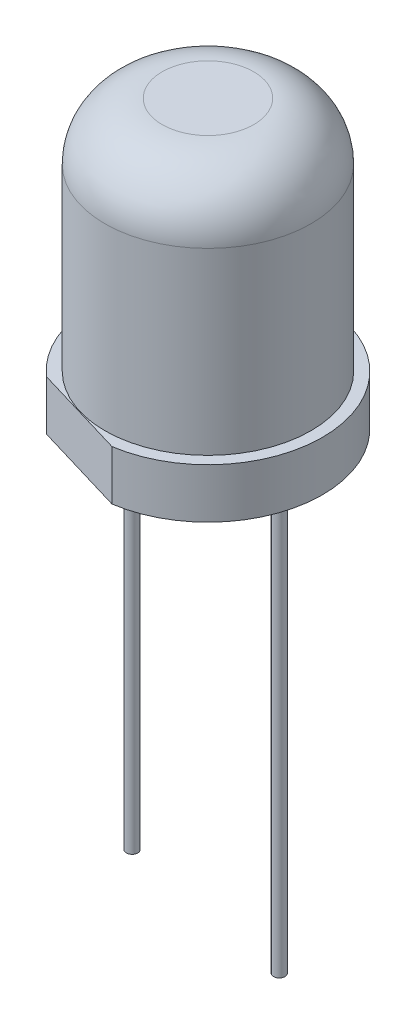
ISO-10303-21;
HEADER;
FILE_DESCRIPTION(('STEP AP214'),'2;1');
FILE_NAME('part.step','',(''),(''),'','','');
FILE_SCHEMA(('AUTOMOTIVE_DESIGN { 1 0 10303 214 1 1 1 1 }'));
ENDSEC;
DATA;
#1=APPLICATION_CONTEXT('core data for automotive mechanical design processes');
#2=APPLICATION_PROTOCOL_DEFINITION('international standard','automotive_design',2000,#1);
#3=PRODUCT_CONTEXT('',#1,'mechanical');
#4=PRODUCT('Part','Part','',(#3));
#5=PRODUCT_RELATED_PRODUCT_CATEGORY('part','',(#4));
#6=PRODUCT_DEFINITION_FORMATION('','',#4);
#7=PRODUCT_DEFINITION_CONTEXT('part definition',#1,'design');
#8=PRODUCT_DEFINITION('design','',#6,#7);
#9=PRODUCT_DEFINITION_SHAPE('','',#8);
#10=(LENGTH_UNIT() NAMED_UNIT(*) SI_UNIT(.MILLI.,.METRE.));
#11=(NAMED_UNIT(*) PLANE_ANGLE_UNIT() SI_UNIT($,.RADIAN.));
#12=(NAMED_UNIT(*) SI_UNIT($,.STERADIAN.) SOLID_ANGLE_UNIT());
#13=UNCERTAINTY_MEASURE_WITH_UNIT(LENGTH_MEASURE(1.E-05),#10,'distance_accuracy_value','');
#14=(GEOMETRIC_REPRESENTATION_CONTEXT(3) GLOBAL_UNCERTAINTY_ASSIGNED_CONTEXT((#13)) GLOBAL_UNIT_ASSIGNED_CONTEXT((#10,
#11,#12)) REPRESENTATION_CONTEXT('',''));
#15=CARTESIAN_POINT('',(0.,0.,0.));
#16=DIRECTION('',(0.,0.,1.));
#17=DIRECTION('',(1.,0.,0.));
#18=AXIS2_PLACEMENT_3D('',#15,#16,#17);
#19=CARTESIAN_POINT('',(4.,25.,0.));
#20=DIRECTION('',(0.,-1.,0.));
#21=DIRECTION('',(1.,0.,0.));
#22=AXIS2_PLACEMENT_3D('',#19,#20,#21);
#23=PLANE('',#22);
#24=CARTESIAN_POINT('',(0.,25.,0.));
#25=DIRECTION('',(0.,1.,0.));
#26=DIRECTION('',(-1.,0.,0.));
#27=AXIS2_PLACEMENT_3D('',#24,#25,#26);
#28=CIRCLE('',#27,4.);
#29=CARTESIAN_POINT('',(-4.,25.,0.));
#30=VERTEX_POINT('',#29);
#31=EDGE_CURVE('E11',#30,#30,#28,.T.);
#32=ORIENTED_EDGE('',*,*,#31,.T.);
#33=EDGE_LOOP('',(#32));
#34=FACE_BOUND('',#33,.T.);
#35=ADVANCED_FACE('F38',(#34),#23,.F.);
#36=CARTESIAN_POINT('',(0.,20.,0.));
#37=DIRECTION('',(0.,1.,0.));
#38=DIRECTION('',(-1.,0.,0.));
#39=AXIS2_PLACEMENT_3D('',#36,#37,#38);
#40=DEGENERATE_TOROIDAL_SURFACE('',#39,4.,5.,.T.);
#41=ORIENTED_EDGE('',*,*,#31,.F.);
#42=EDGE_LOOP('',(#41));
#43=FACE_BOUND('',#42,.T.);
#44=CARTESIAN_POINT('',(0.,20.,0.));
#45=DIRECTION('',(0.,1.,0.));
#46=DIRECTION('',(-1.,0.,0.));
#47=AXIS2_PLACEMENT_3D('',#44,#45,#46);
#48=CIRCLE('',#47,9.);
#49=CARTESIAN_POINT('',(-9.,20.,0.));
#50=VERTEX_POINT('',#49);
#51=EDGE_CURVE('E46',#50,#50,#48,.T.);
#52=ORIENTED_EDGE('',*,*,#51,.T.);
#53=EDGE_LOOP('',(#52));
#54=FACE_BOUND('',#53,.T.);
#55=ADVANCED_FACE('F89',(#43,#54),#40,.T.);
#56=CARTESIAN_POINT('',(0.,25.,0.));
#57=DIRECTION('',(0.,1.,0.));
#58=DIRECTION('',(-1.,0.,0.));
#59=AXIS2_PLACEMENT_3D('',#56,#57,#58);
#60=CYLINDRICAL_SURFACE('',#59,9.);
#61=ORIENTED_EDGE('',*,*,#51,.F.);
#62=EDGE_LOOP('',(#61));
#63=FACE_BOUND('',#62,.T.);
#64=CARTESIAN_POINT('',(0.,4.34657442294423,0.));
#65=DIRECTION('',(0.,1.,0.));
#66=DIRECTION('',(-1.,0.,0.));
#67=AXIS2_PLACEMENT_3D('',#64,#65,#66);
#68=CIRCLE('',#67,9.);
#69=CARTESIAN_POINT('',(-9.,4.34657442294423,0.));
#70=VERTEX_POINT('',#69);
#71=EDGE_CURVE('E79',#70,#70,#68,.T.);
#72=ORIENTED_EDGE('',*,*,#71,.T.);
#73=EDGE_LOOP('',(#72));
#74=FACE_BOUND('',#73,.T.);
#75=ADVANCED_FACE('F91',(#63,#74),#60,.T.);
#76=CARTESIAN_POINT('',(10.,4.34657442294423,0.));
#77=DIRECTION('',(0.,-1.,0.));
#78=DIRECTION('',(1.,0.,0.));
#79=AXIS2_PLACEMENT_3D('',#76,#77,#78);
#80=PLANE('',#79);
#81=ORIENTED_EDGE('',*,*,#71,.F.);
#82=EDGE_LOOP('',(#81));
#83=FACE_BOUND('',#82,.T.);
#84=CARTESIAN_POINT('',(0.,4.34657442294423,0.));
#85=DIRECTION('',(0.,1.,0.));
#86=DIRECTION('',(-1.,0.,0.));
#87=AXIS2_PLACEMENT_3D('',#84,#85,#86);
#88=CIRCLE('',#87,10.);
#89=CARTESIAN_POINT('',(1.50403820163511,4.34657442294423,9.88624646101958));
#90=VERTEX_POINT('',#89);
#91=CARTESIAN_POINT('',(-6.6676674974652,4.34657442294423,7.45266463375659));
#92=VERTEX_POINT('',#91);
#93=EDGE_CURVE('E74',#90,#92,#88,.T.);
#94=ORIENTED_EDGE('',*,*,#93,.T.);
#95=DIRECTION('',(0.958403114541659,0.,0.285418061861629));
#96=VECTOR('',#95,1.);
#97=CARTESIAN_POINT('',(6.60355065171647,4.34657442294423,11.4049111417344));
#98=LINE('',#97,#96);
#99=EDGE_CURVE('E75',#92,#90,#98,.T.);
#100=ORIENTED_EDGE('',*,*,#99,.T.);
#101=EDGE_LOOP('',(#94,#100));
#102=FACE_BOUND('',#101,.T.);
#103=ADVANCED_FACE('F94',(#83,#102),#80,.F.);
#104=CARTESIAN_POINT('',(0.,25.,0.));
#105=DIRECTION('',(0.,1.,0.));
#106=DIRECTION('',(-1.,0.,0.));
#107=AXIS2_PLACEMENT_3D('',#104,#105,#106);
#108=CYLINDRICAL_SURFACE('',#107,10.);
#109=CARTESIAN_POINT('',(0.,0.,0.));
#110=DIRECTION('',(0.,1.,0.));
#111=DIRECTION('',(-1.,0.,0.));
#112=AXIS2_PLACEMENT_3D('',#109,#110,#111);
#113=CIRCLE('',#112,10.);
#114=CARTESIAN_POINT('',(1.50403820163511,0.,9.88624646101958));
#115=VERTEX_POINT('',#114);
#116=CARTESIAN_POINT('',(-6.66766749746519,0.,7.45266463375659));
#117=VERTEX_POINT('',#116);
#118=EDGE_CURVE('E72',#115,#117,#113,.T.);
#119=ORIENTED_EDGE('',*,*,#118,.T.);
#120=DIRECTION('',(0.,-1.,0.));
#121=VECTOR('',#120,1.);
#122=CARTESIAN_POINT('',(-6.6676674974652,10.,7.45266463375659));
#123=LINE('',#122,#121);
#124=EDGE_CURVE('E53',#92,#117,#123,.T.);
#125=ORIENTED_EDGE('',*,*,#124,.F.);
#126=ORIENTED_EDGE('',*,*,#93,.F.);
#127=DIRECTION('',(0.,-1.,0.));
#128=VECTOR('',#127,1.);
#129=CARTESIAN_POINT('',(1.50403820163511,10.,9.88624646101958));
#130=LINE('',#129,#128);
#131=EDGE_CURVE('E58',#90,#115,#130,.T.);
#132=ORIENTED_EDGE('',*,*,#131,.T.);
#133=EDGE_LOOP('',(#119,#125,#126,#132));
#134=FACE_BOUND('',#133,.T.);
#135=ADVANCED_FACE('F71',(#134),#108,.T.);
#136=CARTESIAN_POINT('',(0.,0.,0.));
#137=DIRECTION('',(0.,1.,0.));
#138=DIRECTION('',(-1.,0.,0.));
#139=AXIS2_PLACEMENT_3D('',#136,#137,#138);
#140=PLANE('',#139);
#141=CARTESIAN_POINT('',(1.79379285712363,0.,-4.43584168540967));
#142=DIRECTION('',(0.,-1.,0.));
#143=DIRECTION('',(0.,0.,-1.));
#144=AXIS2_PLACEMENT_3D('',#141,#142,#143);
#145=CIRCLE('',#144,0.5);
#146=CARTESIAN_POINT('',(1.79379285712363,0.,-4.93584168540967));
#147=VERTEX_POINT('',#146);
#148=EDGE_CURVE('E108',#147,#147,#145,.T.);
#149=ORIENTED_EDGE('',*,*,#148,.F.);
#150=EDGE_LOOP('',(#149));
#151=FACE_BOUND('',#150,.T.);
#152=CARTESIAN_POINT('',(-1.44387878180889,0.,5.18249813644365));
#153=DIRECTION('',(0.,1.,0.));
#154=DIRECTION('',(-1.,0.,0.));
#155=AXIS2_PLACEMENT_3D('',#152,#153,#154);
#156=CIRCLE('',#155,0.5);
#157=CARTESIAN_POINT('',(-1.94387878180889,0.,5.18249813644365));
#158=VERTEX_POINT('',#157);
#159=EDGE_CURVE('E41',#158,#158,#156,.T.);
#160=ORIENTED_EDGE('',*,*,#159,.T.);
#161=EDGE_LOOP('',(#160));
#162=FACE_BOUND('',#161,.T.);
#163=ORIENTED_EDGE('',*,*,#118,.F.);
#164=DIRECTION('',(0.958403114541658,0.,0.285418061861629));
#165=VECTOR('',#164,1.);
#166=CARTESIAN_POINT('',(-6.6676674974652,0.,7.45266463375659));
#167=LINE('',#166,#165);
#168=EDGE_CURVE('E63',#117,#115,#167,.T.);
#169=ORIENTED_EDGE('',*,*,#168,.F.);
#170=EDGE_LOOP('',(#163,#169));
#171=FACE_BOUND('',#170,.T.);
#172=ADVANCED_FACE('F77',(#151,#162,#171),#140,.F.);
#173=CARTESIAN_POINT('',(-6.6676674974652,10.,7.45266463375659));
#174=DIRECTION('',(0.285418061861629,0.,-0.958403114541659));
#175=DIRECTION('',(-0.958403114541659,0.,-0.285418061861629));
#176=AXIS2_PLACEMENT_3D('',#173,#174,#175);
#177=PLANE('',#176);
#178=ORIENTED_EDGE('',*,*,#124,.T.);
#179=ORIENTED_EDGE('',*,*,#168,.T.);
#180=ORIENTED_EDGE('',*,*,#131,.F.);
#181=ORIENTED_EDGE('',*,*,#99,.F.);
#182=EDGE_LOOP('',(#178,#179,#180,#181));
#183=FACE_BOUND('',#182,.T.);
#184=ADVANCED_FACE('F64',(#183),#177,.F.);
#185=CARTESIAN_POINT('',(-1.44387878180889,1.85332526638728,5.18249813644365));
#186=DIRECTION('',(0.,-1.,0.));
#187=DIRECTION('',(1.,0.,0.));
#188=AXIS2_PLACEMENT_3D('',#185,#186,#187);
#189=CYLINDRICAL_SURFACE('',#188,0.5);
#190=CARTESIAN_POINT('',(-1.44387878180889,-29.9674653543462,5.18249813644365));
#191=DIRECTION('',(0.,-1.,0.));
#192=DIRECTION('',(1.,0.,0.));
#193=AXIS2_PLACEMENT_3D('',#190,#191,#192);
#194=CIRCLE('',#193,0.5);
#195=CARTESIAN_POINT('',(-0.943878781808895,-29.9674653543462,5.18249813644365));
#196=VERTEX_POINT('',#195);
#197=EDGE_CURVE('E102',#196,#196,#194,.T.);
#198=ORIENTED_EDGE('',*,*,#197,.F.);
#199=EDGE_LOOP('',(#198));
#200=FACE_BOUND('',#199,.T.);
#201=ORIENTED_EDGE('',*,*,#159,.F.);
#202=EDGE_LOOP('',(#201));
#203=FACE_BOUND('',#202,.T.);
#204=ADVANCED_FACE('F120',(#200,#203),#189,.T.);
#205=CARTESIAN_POINT('',(-1.44387878180889,-29.9674653543462,5.18249813644365));
#206=DIRECTION('',(0.,-1.,0.));
#207=DIRECTION('',(1.,0.,0.));
#208=AXIS2_PLACEMENT_3D('',#205,#206,#207);
#209=PLANE('',#208);
#210=ORIENTED_EDGE('',*,*,#197,.T.);
#211=EDGE_LOOP('',(#210));
#212=FACE_BOUND('',#211,.T.);
#213=ADVANCED_FACE('F122',(#212),#209,.T.);
#214=CARTESIAN_POINT('',(1.79379285712363,-42.5080390123185,-4.43584168540967));
#215=DIRECTION('',(0.,-1.,0.));
#216=DIRECTION('',(0.,0.,-1.));
#217=AXIS2_PLACEMENT_3D('',#214,#215,#216);
#218=PLANE('',#217);
#219=CARTESIAN_POINT('',(1.79379285712363,-42.5080390123185,-4.43584168540967));
#220=DIRECTION('',(0.,-1.,0.));
#221=DIRECTION('',(0.,0.,-1.));
#222=AXIS2_PLACEMENT_3D('',#219,#220,#221);
#223=CIRCLE('',#222,0.5);
#224=CARTESIAN_POINT('',(1.79379285712363,-42.5080390123185,-4.93584168540967));
#225=VERTEX_POINT('',#224);
#226=EDGE_CURVE('E105',#225,#225,#223,.T.);
#227=ORIENTED_EDGE('',*,*,#226,.T.);
#228=EDGE_LOOP('',(#227));
#229=FACE_BOUND('',#228,.T.);
#230=ADVANCED_FACE('F129',(#229),#218,.T.);
#231=CARTESIAN_POINT('',(1.79379285712363,0.,-4.43584168540967));
#232=DIRECTION('',(0.,-1.,0.));
#233=DIRECTION('',(0.,0.,-1.));
#234=AXIS2_PLACEMENT_3D('',#231,#232,#233);
#235=CYLINDRICAL_SURFACE('',#234,0.5);
#236=ORIENTED_EDGE('',*,*,#226,.F.);
#237=EDGE_LOOP('',(#236));
#238=FACE_BOUND('',#237,.T.);
#239=ORIENTED_EDGE('',*,*,#148,.T.);
#240=EDGE_LOOP('',(#239));
#241=FACE_BOUND('',#240,.T.);
#242=ADVANCED_FACE('F112',(#238,#241),#235,.T.);
#243=CLOSED_SHELL('',(#35,#55,#75,#103,#135,#172,#184,#204,#213,#230,#242));
#244=MANIFOLD_SOLID_BREP('B2',#243);
#245=ADVANCED_BREP_SHAPE_REPRESENTATION('',(#18,#244),#14);
#246=SHAPE_DEFINITION_REPRESENTATION(#9,#245);
ENDSEC;
END-ISO-10303-21;
